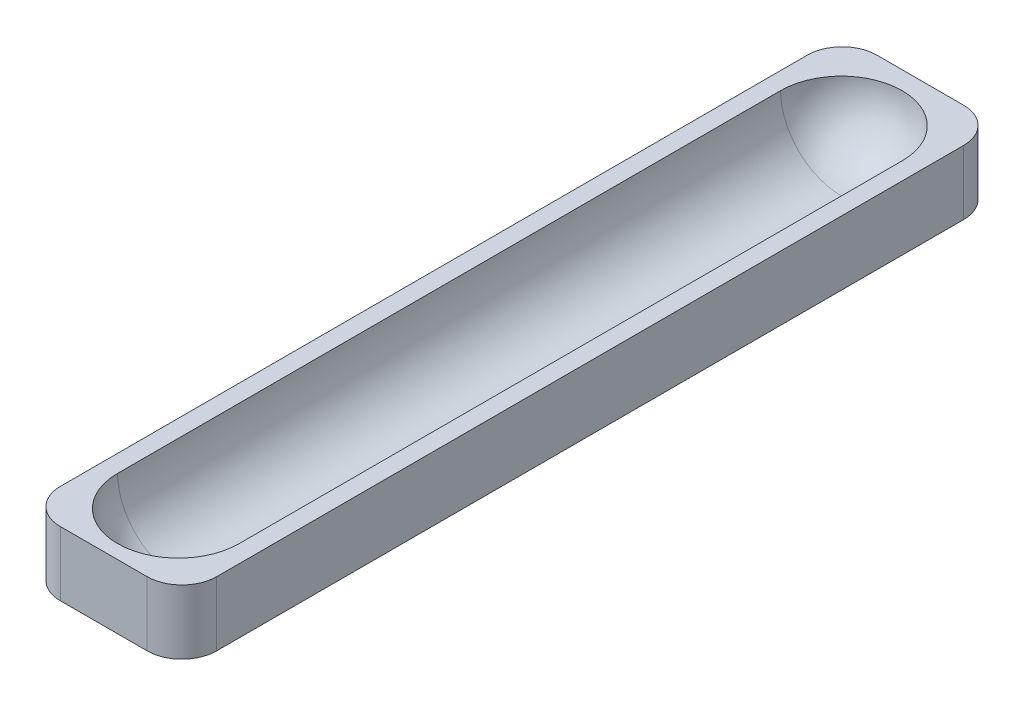
ISO-10303-21;
HEADER;
FILE_DESCRIPTION(('STEP AP214'),'2;1');
FILE_NAME('part.step','',(''),(''),'','','');
FILE_SCHEMA(('AUTOMOTIVE_DESIGN { 1 0 10303 214 1 1 1 1 }'));
ENDSEC;
DATA;
#1=APPLICATION_CONTEXT('core data for automotive mechanical design processes');
#2=APPLICATION_PROTOCOL_DEFINITION('international standard','automotive_design',2000,#1);
#3=PRODUCT_CONTEXT('',#1,'mechanical');
#4=PRODUCT('Part','Part','',(#3));
#5=PRODUCT_RELATED_PRODUCT_CATEGORY('part','',(#4));
#6=PRODUCT_DEFINITION_FORMATION('','',#4);
#7=PRODUCT_DEFINITION_CONTEXT('part definition',#1,'design');
#8=PRODUCT_DEFINITION('design','',#6,#7);
#9=PRODUCT_DEFINITION_SHAPE('','',#8);
#10=(LENGTH_UNIT() NAMED_UNIT(*) SI_UNIT(.MILLI.,.METRE.));
#11=(NAMED_UNIT(*) PLANE_ANGLE_UNIT() SI_UNIT($,.RADIAN.));
#12=(NAMED_UNIT(*) SI_UNIT($,.STERADIAN.) SOLID_ANGLE_UNIT());
#13=UNCERTAINTY_MEASURE_WITH_UNIT(LENGTH_MEASURE(1.E-05),#10,'distance_accuracy_value','');
#14=(GEOMETRIC_REPRESENTATION_CONTEXT(3) GLOBAL_UNCERTAINTY_ASSIGNED_CONTEXT((#13)) GLOBAL_UNIT_ASSIGNED_CONTEXT((#10,
#11,#12)) REPRESENTATION_CONTEXT('',''));
#15=CARTESIAN_POINT('',(0.,0.,0.));
#16=DIRECTION('',(0.,0.,1.));
#17=DIRECTION('',(1.,0.,0.));
#18=AXIS2_PLACEMENT_3D('',#15,#16,#17);
#19=CARTESIAN_POINT('',(-114.3,46.99,0.));
#20=DIRECTION('',(-1.,0.,0.));
#21=DIRECTION('',(0.,0.,1.));
#22=AXIS2_PLACEMENT_3D('',#19,#20,#21);
#23=PLANE('',#22);
#24=DIRECTION('',(0.,0.,-1.));
#25=VECTOR('',#24,1.);
#26=CARTESIAN_POINT('',(-114.3,0.,0.));
#27=LINE('',#26,#25);
#28=CARTESIAN_POINT('',(-114.3,0.,-25.4));
#29=VERTEX_POINT('',#28);
#30=CARTESIAN_POINT('',(-114.3,0.,-571.5));
#31=VERTEX_POINT('',#30);
#32=EDGE_CURVE('E138',#29,#31,#27,.T.);
#33=ORIENTED_EDGE('',*,*,#32,.F.);
#34=DIRECTION('',(0.,-1.,0.));
#35=VECTOR('',#34,1.);
#36=CARTESIAN_POINT('',(-114.3,46.99,-25.4));
#37=LINE('',#36,#35);
#38=CARTESIAN_POINT('',(-114.3,46.99,-25.4));
#39=VERTEX_POINT('',#38);
#40=EDGE_CURVE('E187',#29,#39,#37,.F.);
#41=ORIENTED_EDGE('',*,*,#40,.T.);
#42=DIRECTION('',(0.,0.,-1.));
#43=VECTOR('',#42,1.);
#44=CARTESIAN_POINT('',(-114.3,46.99,0.));
#45=LINE('',#44,#43);
#46=CARTESIAN_POINT('',(-114.3,46.99,-571.5));
#47=VERTEX_POINT('',#46);
#48=EDGE_CURVE('E139',#39,#47,#45,.T.);
#49=ORIENTED_EDGE('',*,*,#48,.T.);
#50=DIRECTION('',(0.,-1.,0.));
#51=VECTOR('',#50,1.);
#52=CARTESIAN_POINT('',(-114.3,0.,-571.5));
#53=LINE('',#52,#51);
#54=EDGE_CURVE('E184',#47,#31,#53,.T.);
#55=ORIENTED_EDGE('',*,*,#54,.T.);
#56=EDGE_LOOP('',(#33,#41,#49,#55));
#57=FACE_BOUND('',#56,.T.);
#58=ADVANCED_FACE('F37',(#57),#23,.T.);
#59=CARTESIAN_POINT('',(0.,46.99,0.));
#60=DIRECTION('',(0.,0.,1.));
#61=DIRECTION('',(1.,0.,0.));
#62=AXIS2_PLACEMENT_3D('',#59,#60,#61);
#63=PLANE('',#62);
#64=DIRECTION('',(-1.,0.,0.));
#65=VECTOR('',#64,1.);
#66=CARTESIAN_POINT('',(0.,0.,0.));
#67=LINE('',#66,#65);
#68=CARTESIAN_POINT('',(-25.4,0.,0.));
#69=VERTEX_POINT('',#68);
#70=CARTESIAN_POINT('',(-88.9,0.,0.));
#71=VERTEX_POINT('',#70);
#72=EDGE_CURVE('E153',#69,#71,#67,.T.);
#73=ORIENTED_EDGE('',*,*,#72,.F.);
#74=DIRECTION('',(0.,-1.,0.));
#75=VECTOR('',#74,1.);
#76=CARTESIAN_POINT('',(-25.4,46.99,0.));
#77=LINE('',#76,#75);
#78=CARTESIAN_POINT('',(-25.4,46.99,0.));
#79=VERTEX_POINT('',#78);
#80=EDGE_CURVE('E175',#69,#79,#77,.F.);
#81=ORIENTED_EDGE('',*,*,#80,.T.);
#82=DIRECTION('',(-1.,0.,0.));
#83=VECTOR('',#82,1.);
#84=CARTESIAN_POINT('',(0.,46.99,0.));
#85=LINE('',#84,#83);
#86=CARTESIAN_POINT('',(-88.9,46.99,0.));
#87=VERTEX_POINT('',#86);
#88=EDGE_CURVE('E142',#79,#87,#85,.T.);
#89=ORIENTED_EDGE('',*,*,#88,.T.);
#90=DIRECTION('',(0.,-1.,0.));
#91=VECTOR('',#90,1.);
#92=CARTESIAN_POINT('',(-88.9,46.99,0.));
#93=LINE('',#92,#91);
#94=EDGE_CURVE('E172',#87,#71,#93,.T.);
#95=ORIENTED_EDGE('',*,*,#94,.T.);
#96=EDGE_LOOP('',(#73,#81,#89,#95));
#97=FACE_BOUND('',#96,.T.);
#98=ADVANCED_FACE('F211',(#97),#63,.T.);
#99=CARTESIAN_POINT('',(0.,46.99,0.));
#100=DIRECTION('',(-1.,0.,0.));
#101=DIRECTION('',(0.,0.,1.));
#102=AXIS2_PLACEMENT_3D('',#99,#100,#101);
#103=PLANE('',#102);
#104=DIRECTION('',(0.,0.,-1.));
#105=VECTOR('',#104,1.);
#106=CARTESIAN_POINT('',(0.,46.99,0.));
#107=LINE('',#106,#105);
#108=CARTESIAN_POINT('',(0.,46.99,-25.4));
#109=VERTEX_POINT('',#108);
#110=CARTESIAN_POINT('',(0.,46.99,-571.5));
#111=VERTEX_POINT('',#110);
#112=EDGE_CURVE('E146',#109,#111,#107,.T.);
#113=ORIENTED_EDGE('',*,*,#112,.F.);
#114=DIRECTION('',(0.,-1.,0.));
#115=VECTOR('',#114,1.);
#116=CARTESIAN_POINT('',(0.,0.,-25.4));
#117=LINE('',#116,#115);
#118=CARTESIAN_POINT('',(0.,0.,-25.4));
#119=VERTEX_POINT('',#118);
#120=EDGE_CURVE('E161',#109,#119,#117,.T.);
#121=ORIENTED_EDGE('',*,*,#120,.T.);
#122=DIRECTION('',(0.,0.,-1.));
#123=VECTOR('',#122,1.);
#124=CARTESIAN_POINT('',(0.,0.,0.));
#125=LINE('',#124,#123);
#126=CARTESIAN_POINT('',(0.,0.,-571.5));
#127=VERTEX_POINT('',#126);
#128=EDGE_CURVE('E156',#119,#127,#125,.T.);
#129=ORIENTED_EDGE('',*,*,#128,.T.);
#130=DIRECTION('',(0.,-1.,0.));
#131=VECTOR('',#130,1.);
#132=CARTESIAN_POINT('',(0.,46.99,-571.5));
#133=LINE('',#132,#131);
#134=EDGE_CURVE('E150',#127,#111,#133,.F.);
#135=ORIENTED_EDGE('',*,*,#134,.T.);
#136=EDGE_LOOP('',(#113,#121,#129,#135));
#137=FACE_BOUND('',#136,.T.);
#138=ADVANCED_FACE('F219',(#137),#103,.F.);
#139=CARTESIAN_POINT('',(0.,46.99,-596.9));
#140=DIRECTION('',(0.,0.,1.));
#141=DIRECTION('',(1.,0.,0.));
#142=AXIS2_PLACEMENT_3D('',#139,#140,#141);
#143=PLANE('',#142);
#144=DIRECTION('',(-1.,0.,0.));
#145=VECTOR('',#144,1.);
#146=CARTESIAN_POINT('',(0.,0.,-596.9));
#147=LINE('',#146,#145);
#148=CARTESIAN_POINT('',(-25.4,0.,-596.9));
#149=VERTEX_POINT('',#148);
#150=CARTESIAN_POINT('',(-88.9000000000004,0.,-596.9));
#151=VERTEX_POINT('',#150);
#152=EDGE_CURVE('E143',#149,#151,#147,.T.);
#153=ORIENTED_EDGE('',*,*,#152,.T.);
#154=DIRECTION('',(0.,-1.,0.));
#155=VECTOR('',#154,1.);
#156=CARTESIAN_POINT('',(-88.9000000000004,46.99,-596.9));
#157=LINE('',#156,#155);
#158=CARTESIAN_POINT('',(-88.9000000000004,46.99,-596.9));
#159=VERTEX_POINT('',#158);
#160=EDGE_CURVE('E11',#151,#159,#157,.F.);
#161=ORIENTED_EDGE('',*,*,#160,.T.);
#162=DIRECTION('',(-1.,0.,0.));
#163=VECTOR('',#162,1.);
#164=CARTESIAN_POINT('',(0.,46.99,-596.9));
#165=LINE('',#164,#163);
#166=CARTESIAN_POINT('',(-25.4,46.99,-596.9));
#167=VERTEX_POINT('',#166);
#168=EDGE_CURVE('E148',#167,#159,#165,.T.);
#169=ORIENTED_EDGE('',*,*,#168,.F.);
#170=DIRECTION('',(0.,-1.,0.));
#171=VECTOR('',#170,1.);
#172=CARTESIAN_POINT('',(-25.4,46.99,-596.9));
#173=LINE('',#172,#171);
#174=EDGE_CURVE('E45',#167,#149,#173,.T.);
#175=ORIENTED_EDGE('',*,*,#174,.T.);
#176=EDGE_LOOP('',(#153,#161,#169,#175));
#177=FACE_BOUND('',#176,.T.);
#178=ADVANCED_FACE('F191',(#177),#143,.F.);
#179=CARTESIAN_POINT('',(0.,46.99,0.));
#180=DIRECTION('',(0.,1.,0.));
#181=DIRECTION('',(0.,0.,1.));
#182=AXIS2_PLACEMENT_3D('',#179,#180,#181);
#183=PLANE('',#182);
#184=DIRECTION('',(0.,0.,-1.));
#185=VECTOR('',#184,1.);
#186=CARTESIAN_POINT('',(-101.6,46.9900000000003,0.));
#187=LINE('',#186,#185);
#188=CARTESIAN_POINT('',(-101.6,46.9900000000003,-54.5594703768595));
#189=VERTEX_POINT('',#188);
#190=CARTESIAN_POINT('',(-101.6,46.9900000000003,-539.208766563519));
#191=VERTEX_POINT('',#190);
#192=EDGE_CURVE('E122',#189,#191,#187,.T.);
#193=ORIENTED_EDGE('',*,*,#192,.T.);
#194=CARTESIAN_POINT('',(-57.15,46.99,-539.208766563519));
#195=DIRECTION('',(0.,-1.,0.));
#196=DIRECTION('',(0.,0.,1.));
#197=AXIS2_PLACEMENT_3D('',#194,#195,#196);
#198=CIRCLE('',#197,44.45);
#199=CARTESIAN_POINT('',(-12.7000000000002,46.99,-539.208766563519));
#200=VERTEX_POINT('',#199);
#201=EDGE_CURVE('E117',#191,#200,#198,.T.);
#202=ORIENTED_EDGE('',*,*,#201,.T.);
#203=DIRECTION('',(0.,0.,-1.));
#204=VECTOR('',#203,1.);
#205=CARTESIAN_POINT('',(-12.7000000000001,46.99,0.));
#206=LINE('',#205,#204);
#207=CARTESIAN_POINT('',(-12.7000000000001,46.99,-54.5594703768595));
#208=VERTEX_POINT('',#207);
#209=EDGE_CURVE('E125',#208,#200,#206,.T.);
#210=ORIENTED_EDGE('',*,*,#209,.F.);
#211=CARTESIAN_POINT('',(-57.1500000000001,46.99,-54.5594703768595));
#212=DIRECTION('',(0.,-1.,0.));
#213=DIRECTION('',(0.,0.,1.));
#214=AXIS2_PLACEMENT_3D('',#211,#212,#213);
#215=CIRCLE('',#214,44.45);
#216=EDGE_CURVE('E132',#208,#189,#215,.T.);
#217=ORIENTED_EDGE('',*,*,#216,.T.);
#218=EDGE_LOOP('',(#193,#202,#210,#217));
#219=FACE_BOUND('',#218,.T.);
#220=ORIENTED_EDGE('',*,*,#88,.F.);
#221=CARTESIAN_POINT('',(-25.4,46.99,-25.4));
#222=DIRECTION('',(0.,1.,0.));
#223=DIRECTION('',(0.,0.,1.));
#224=AXIS2_PLACEMENT_3D('',#221,#222,#223);
#225=CIRCLE('',#224,25.4);
#226=EDGE_CURVE('E182',#79,#109,#225,.T.);
#227=ORIENTED_EDGE('',*,*,#226,.T.);
#228=ORIENTED_EDGE('',*,*,#112,.T.);
#229=CARTESIAN_POINT('',(-25.4,46.99,-571.5));
#230=DIRECTION('',(0.,1.,0.));
#231=DIRECTION('',(0.,0.,1.));
#232=AXIS2_PLACEMENT_3D('',#229,#230,#231);
#233=CIRCLE('',#232,25.4);
#234=EDGE_CURVE('E57',#111,#167,#233,.T.);
#235=ORIENTED_EDGE('',*,*,#234,.T.);
#236=ORIENTED_EDGE('',*,*,#168,.T.);
#237=CARTESIAN_POINT('',(-88.9000000000004,46.99,-571.5));
#238=DIRECTION('',(0.,1.,0.));
#239=DIRECTION('',(0.,0.,1.));
#240=AXIS2_PLACEMENT_3D('',#237,#238,#239);
#241=CIRCLE('',#240,25.4);
#242=EDGE_CURVE('E178',#159,#47,#241,.T.);
#243=ORIENTED_EDGE('',*,*,#242,.T.);
#244=ORIENTED_EDGE('',*,*,#48,.F.);
#245=CARTESIAN_POINT('',(-88.9,46.99,-25.4000000000001));
#246=DIRECTION('',(0.,1.,0.));
#247=DIRECTION('',(0.,0.,1.));
#248=AXIS2_PLACEMENT_3D('',#245,#246,#247);
#249=CIRCLE('',#248,25.4);
#250=EDGE_CURVE('E180',#39,#87,#249,.T.);
#251=ORIENTED_EDGE('',*,*,#250,.T.);
#252=EDGE_LOOP('',(#220,#227,#228,#235,#236,#243,#244,#251));
#253=FACE_BOUND('',#252,.T.);
#254=ADVANCED_FACE('F131',(#219,#253),#183,.T.);
#255=CARTESIAN_POINT('',(0.,0.,0.));
#256=DIRECTION('',(0.,1.,0.));
#257=DIRECTION('',(0.,0.,1.));
#258=AXIS2_PLACEMENT_3D('',#255,#256,#257);
#259=PLANE('',#258);
#260=ORIENTED_EDGE('',*,*,#128,.F.);
#261=CARTESIAN_POINT('',(-25.4,0.,-25.4));
#262=DIRECTION('',(0.,1.,0.));
#263=DIRECTION('',(0.,0.,1.));
#264=AXIS2_PLACEMENT_3D('',#261,#262,#263);
#265=CIRCLE('',#264,25.4);
#266=EDGE_CURVE('E170',#119,#69,#265,.F.);
#267=ORIENTED_EDGE('',*,*,#266,.T.);
#268=ORIENTED_EDGE('',*,*,#72,.T.);
#269=CARTESIAN_POINT('',(-88.9,0.,-25.4000000000001));
#270=DIRECTION('',(0.,1.,0.));
#271=DIRECTION('',(0.,0.,1.));
#272=AXIS2_PLACEMENT_3D('',#269,#270,#271);
#273=CIRCLE('',#272,25.4);
#274=EDGE_CURVE('E168',#71,#29,#273,.F.);
#275=ORIENTED_EDGE('',*,*,#274,.T.);
#276=ORIENTED_EDGE('',*,*,#32,.T.);
#277=CARTESIAN_POINT('',(-88.9000000000004,0.,-571.5));
#278=DIRECTION('',(0.,1.,0.));
#279=DIRECTION('',(0.,0.,1.));
#280=AXIS2_PLACEMENT_3D('',#277,#278,#279);
#281=CIRCLE('',#280,25.4);
#282=EDGE_CURVE('E166',#31,#151,#281,.F.);
#283=ORIENTED_EDGE('',*,*,#282,.T.);
#284=ORIENTED_EDGE('',*,*,#152,.F.);
#285=CARTESIAN_POINT('',(-25.4,0.,-571.5));
#286=DIRECTION('',(0.,1.,0.));
#287=DIRECTION('',(0.,0.,1.));
#288=AXIS2_PLACEMENT_3D('',#285,#286,#287);
#289=CIRCLE('',#288,25.4);
#290=EDGE_CURVE('E164',#149,#127,#289,.F.);
#291=ORIENTED_EDGE('',*,*,#290,.T.);
#292=EDGE_LOOP('',(#260,#267,#268,#275,#276,#283,#284,#291));
#293=FACE_BOUND('',#292,.T.);
#294=ADVANCED_FACE('F195',(#293),#259,.F.);
#295=CARTESIAN_POINT('',(-57.15,46.99,-539.208766563519));
#296=DIRECTION('',(0.,0.,1.));
#297=DIRECTION('',(-1.,0.,0.));
#298=AXIS2_PLACEMENT_3D('',#295,#296,#297);
#299=SPHERICAL_SURFACE('',#298,44.45);
#300=ORIENTED_EDGE('',*,*,#201,.F.);
#301=CARTESIAN_POINT('',(-57.1500000000001,46.99,-539.208766563519));
#302=DIRECTION('',(0.,0.,1.));
#303=DIRECTION('',(1.,0.,0.));
#304=AXIS2_PLACEMENT_3D('',#301,#302,#303);
#305=CIRCLE('',#304,44.4499999999999);
#306=EDGE_CURVE('E113',#191,#200,#305,.T.);
#307=ORIENTED_EDGE('',*,*,#306,.T.);
#308=EDGE_LOOP('',(#300,#307));
#309=FACE_BOUND('',#308,.T.);
#310=ADVANCED_FACE('F115',(#309),#299,.F.);
#311=CARTESIAN_POINT('',(-57.1500000000001,46.99,-54.5594703768595));
#312=DIRECTION('',(0.,0.,1.));
#313=DIRECTION('',(1.,0.,0.));
#314=AXIS2_PLACEMENT_3D('',#311,#312,#313);
#315=SPHERICAL_SURFACE('',#314,44.45);
#316=CARTESIAN_POINT('',(-57.15,46.99,-54.5594703768595));
#317=DIRECTION('',(0.,0.,1.));
#318=DIRECTION('',(1.,0.,0.));
#319=AXIS2_PLACEMENT_3D('',#316,#317,#318);
#320=CIRCLE('',#319,44.4499999999999);
#321=EDGE_CURVE('E121',#189,#208,#320,.T.);
#322=ORIENTED_EDGE('',*,*,#321,.F.);
#323=ORIENTED_EDGE('',*,*,#216,.F.);
#324=EDGE_LOOP('',(#322,#323));
#325=FACE_BOUND('',#324,.T.);
#326=ADVANCED_FACE('F265',(#325),#315,.F.);
#327=CARTESIAN_POINT('',(-57.1500000000001,46.99,-596.9));
#328=DIRECTION('',(0.,0.,1.));
#329=DIRECTION('',(1.,0.,0.));
#330=AXIS2_PLACEMENT_3D('',#327,#328,#329);
#331=CYLINDRICAL_SURFACE('',#330,44.4499999999999);
#332=ORIENTED_EDGE('',*,*,#192,.F.);
#333=ORIENTED_EDGE('',*,*,#321,.T.);
#334=ORIENTED_EDGE('',*,*,#209,.T.);
#335=ORIENTED_EDGE('',*,*,#306,.F.);
#336=EDGE_LOOP('',(#332,#333,#334,#335));
#337=FACE_BOUND('',#336,.T.);
#338=ADVANCED_FACE('F126',(#337),#331,.F.);
#339=CARTESIAN_POINT('',(-25.4,46.99,-25.4));
#340=DIRECTION('',(0.,1.,0.));
#341=DIRECTION('',(0.,0.,1.));
#342=AXIS2_PLACEMENT_3D('',#339,#340,#341);
#343=CYLINDRICAL_SURFACE('',#342,25.4);
#344=ORIENTED_EDGE('',*,*,#226,.F.);
#345=ORIENTED_EDGE('',*,*,#80,.F.);
#346=ORIENTED_EDGE('',*,*,#266,.F.);
#347=ORIENTED_EDGE('',*,*,#120,.F.);
#348=EDGE_LOOP('',(#344,#345,#346,#347));
#349=FACE_BOUND('',#348,.T.);
#350=ADVANCED_FACE('F216',(#349),#343,.T.);
#351=CARTESIAN_POINT('',(-88.9,46.99,-25.4000000000001));
#352=DIRECTION('',(0.,-1.,0.));
#353=DIRECTION('',(0.,0.,-1.));
#354=AXIS2_PLACEMENT_3D('',#351,#352,#353);
#355=CYLINDRICAL_SURFACE('',#354,25.4);
#356=ORIENTED_EDGE('',*,*,#250,.F.);
#357=ORIENTED_EDGE('',*,*,#40,.F.);
#358=ORIENTED_EDGE('',*,*,#274,.F.);
#359=ORIENTED_EDGE('',*,*,#94,.F.);
#360=EDGE_LOOP('',(#356,#357,#358,#359));
#361=FACE_BOUND('',#360,.T.);
#362=ADVANCED_FACE('F208',(#361),#355,.T.);
#363=CARTESIAN_POINT('',(-88.9000000000004,46.99,-571.5));
#364=DIRECTION('',(0.,1.,0.));
#365=DIRECTION('',(0.,0.,1.));
#366=AXIS2_PLACEMENT_3D('',#363,#364,#365);
#367=CYLINDRICAL_SURFACE('',#366,25.4);
#368=ORIENTED_EDGE('',*,*,#242,.F.);
#369=ORIENTED_EDGE('',*,*,#160,.F.);
#370=ORIENTED_EDGE('',*,*,#282,.F.);
#371=ORIENTED_EDGE('',*,*,#54,.F.);
#372=EDGE_LOOP('',(#368,#369,#370,#371));
#373=FACE_BOUND('',#372,.T.);
#374=ADVANCED_FACE('F200',(#373),#367,.T.);
#375=CARTESIAN_POINT('',(-25.4,46.99,-571.5));
#376=DIRECTION('',(0.,-1.,0.));
#377=DIRECTION('',(0.,0.,-1.));
#378=AXIS2_PLACEMENT_3D('',#375,#376,#377);
#379=CYLINDRICAL_SURFACE('',#378,25.4);
#380=ORIENTED_EDGE('',*,*,#234,.F.);
#381=ORIENTED_EDGE('',*,*,#134,.F.);
#382=ORIENTED_EDGE('',*,*,#290,.F.);
#383=ORIENTED_EDGE('',*,*,#174,.F.);
#384=EDGE_LOOP('',(#380,#381,#382,#383));
#385=FACE_BOUND('',#384,.T.);
#386=ADVANCED_FACE('F39',(#385),#379,.T.);
#387=CLOSED_SHELL('',(#58,#98,#138,#178,#254,#294,#310,#326,#338,#350,#362,#374,#386));
#388=MANIFOLD_SOLID_BREP('B2',#387);
#389=ADVANCED_BREP_SHAPE_REPRESENTATION('',(#18,#388),#14);
#390=SHAPE_DEFINITION_REPRESENTATION(#9,#389);
ENDSEC;
END-ISO-10303-21;
